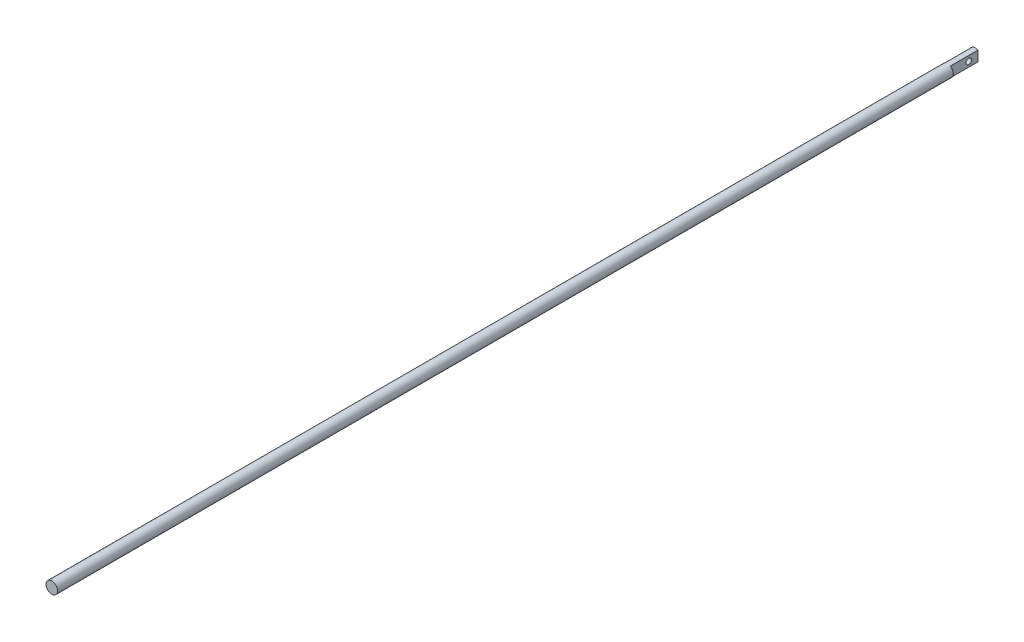
ISO-10303-21;
HEADER;
FILE_DESCRIPTION(('STEP AP214'),'2;1');
FILE_NAME('part.step','',(''),(''),'','','');
FILE_SCHEMA(('AUTOMOTIVE_DESIGN { 1 0 10303 214 1 1 1 1 }'));
ENDSEC;
DATA;
#1=APPLICATION_CONTEXT('core data for automotive mechanical design processes');
#2=APPLICATION_PROTOCOL_DEFINITION('international standard','automotive_design',2000,#1);
#3=PRODUCT_CONTEXT('',#1,'mechanical');
#4=PRODUCT('Part','Part','',(#3));
#5=PRODUCT_RELATED_PRODUCT_CATEGORY('part','',(#4));
#6=PRODUCT_DEFINITION_FORMATION('','',#4);
#7=PRODUCT_DEFINITION_CONTEXT('part definition',#1,'design');
#8=PRODUCT_DEFINITION('design','',#6,#7);
#9=PRODUCT_DEFINITION_SHAPE('','',#8);
#10=(LENGTH_UNIT() NAMED_UNIT(*) SI_UNIT(.MILLI.,.METRE.));
#11=(NAMED_UNIT(*) PLANE_ANGLE_UNIT() SI_UNIT($,.RADIAN.));
#12=(NAMED_UNIT(*) SI_UNIT($,.STERADIAN.) SOLID_ANGLE_UNIT());
#13=UNCERTAINTY_MEASURE_WITH_UNIT(LENGTH_MEASURE(1.E-05),#10,'distance_accuracy_value','');
#14=(GEOMETRIC_REPRESENTATION_CONTEXT(3) GLOBAL_UNCERTAINTY_ASSIGNED_CONTEXT((#13)) GLOBAL_UNIT_ASSIGNED_CONTEXT((#10,
#11,#12)) REPRESENTATION_CONTEXT('',''));
#15=CARTESIAN_POINT('',(0.,0.,0.));
#16=DIRECTION('',(0.,0.,1.));
#17=DIRECTION('',(1.,0.,0.));
#18=AXIS2_PLACEMENT_3D('',#15,#16,#17);
#19=CARTESIAN_POINT('',(0.762000000000001,-1.5875,0.));
#20=DIRECTION('',(-1.,0.,0.));
#21=DIRECTION('',(0.,0.,1.));
#22=AXIS2_PLACEMENT_3D('',#19,#20,#21);
#23=PLANE('',#22);
#24=DIRECTION('',(0.,1.,0.));
#25=VECTOR('',#24,1.);
#26=CARTESIAN_POINT('',(0.762000000000001,-1.5875,7.62));
#27=LINE('',#26,#25);
#28=CARTESIAN_POINT('',(0.762000000000001,-1.39266372466579,7.61999999999999));
#29=VERTEX_POINT('',#28);
#30=CARTESIAN_POINT('',(0.762000000000001,1.39266372466579,7.61999999999999));
#31=VERTEX_POINT('',#30);
#32=EDGE_CURVE('E82',#29,#31,#27,.T.);
#33=ORIENTED_EDGE('',*,*,#32,.F.);
#34=DIRECTION('',(0.,0.,-1.));
#35=VECTOR('',#34,1.);
#36=CARTESIAN_POINT('',(0.762000000000004,-1.39266372466579,254.));
#37=LINE('',#36,#35);
#38=CARTESIAN_POINT('',(0.762000000000001,-1.39266372466579,0.));
#39=VERTEX_POINT('',#38);
#40=EDGE_CURVE('E92',#39,#29,#37,.F.);
#41=ORIENTED_EDGE('',*,*,#40,.F.);
#42=DIRECTION('',(0.,-1.,0.));
#43=VECTOR('',#42,1.);
#44=CARTESIAN_POINT('',(0.762000000000001,0.,0.));
#45=LINE('',#44,#43);
#46=CARTESIAN_POINT('',(0.762000000000001,1.39266372466579,0.));
#47=VERTEX_POINT('',#46);
#48=EDGE_CURVE('E86',#47,#39,#45,.T.);
#49=ORIENTED_EDGE('',*,*,#48,.F.);
#50=DIRECTION('',(0.,0.,-1.));
#51=VECTOR('',#50,1.);
#52=CARTESIAN_POINT('',(0.762000000000004,1.39266372466579,254.));
#53=LINE('',#52,#51);
#54=EDGE_CURVE('E88',#31,#47,#53,.T.);
#55=ORIENTED_EDGE('',*,*,#54,.F.);
#56=EDGE_LOOP('',(#33,#41,#49,#55));
#57=FACE_BOUND('',#56,.T.);
#58=CARTESIAN_POINT('',(0.762000000000001,0.,2.54));
#59=DIRECTION('',(-1.,0.,0.));
#60=DIRECTION('',(0.,0.,1.));
#61=AXIS2_PLACEMENT_3D('',#58,#59,#60);
#62=CIRCLE('',#61,0.762);
#63=CARTESIAN_POINT('',(0.762000000000001,0.,3.302));
#64=VERTEX_POINT('',#63);
#65=EDGE_CURVE('E110',#64,#64,#62,.T.);
#66=ORIENTED_EDGE('',*,*,#65,.T.);
#67=EDGE_LOOP('',(#66));
#68=FACE_BOUND('',#67,.T.);
#69=ADVANCED_FACE('F33',(#57,#68),#23,.F.);
#70=CARTESIAN_POINT('',(-0.761999999999999,-1.5875,0.));
#71=DIRECTION('',(1.,0.,0.));
#72=DIRECTION('',(0.,0.,-1.));
#73=AXIS2_PLACEMENT_3D('',#70,#71,#72);
#74=PLANE('',#73);
#75=DIRECTION('',(0.,1.,0.));
#76=VECTOR('',#75,1.);
#77=CARTESIAN_POINT('',(-0.761999999999999,-1.5875,7.62));
#78=LINE('',#77,#76);
#79=CARTESIAN_POINT('',(-0.761999999999999,-1.39266372466579,7.61999999999999));
#80=VERTEX_POINT('',#79);
#81=CARTESIAN_POINT('',(-0.761999999999999,1.39266372466579,7.61999999999999));
#82=VERTEX_POINT('',#81);
#83=EDGE_CURVE('E108',#80,#82,#78,.T.);
#84=ORIENTED_EDGE('',*,*,#83,.T.);
#85=DIRECTION('',(0.,0.,-1.));
#86=VECTOR('',#85,1.);
#87=CARTESIAN_POINT('',(-0.761999999999996,1.3926637246658,254.));
#88=LINE('',#87,#86);
#89=CARTESIAN_POINT('',(-0.761999999999999,1.39266372466579,0.));
#90=VERTEX_POINT('',#89);
#91=EDGE_CURVE('E48',#90,#82,#88,.F.);
#92=ORIENTED_EDGE('',*,*,#91,.F.);
#93=DIRECTION('',(0.,1.,0.));
#94=VECTOR('',#93,1.);
#95=CARTESIAN_POINT('',(-0.761999999999999,0.,0.));
#96=LINE('',#95,#94);
#97=CARTESIAN_POINT('',(-0.761999999999999,-1.39266372466579,0.));
#98=VERTEX_POINT('',#97);
#99=EDGE_CURVE('E41',#98,#90,#96,.T.);
#100=ORIENTED_EDGE('',*,*,#99,.F.);
#101=DIRECTION('',(0.,0.,-1.));
#102=VECTOR('',#101,1.);
#103=CARTESIAN_POINT('',(-0.761999999999996,-1.3926637246658,254.));
#104=LINE('',#103,#102);
#105=EDGE_CURVE('E76',#80,#98,#104,.T.);
#106=ORIENTED_EDGE('',*,*,#105,.F.);
#107=EDGE_LOOP('',(#84,#92,#100,#106));
#108=FACE_BOUND('',#107,.T.);
#109=CARTESIAN_POINT('',(-0.761999999999999,0.,2.54));
#110=DIRECTION('',(1.,0.,0.));
#111=DIRECTION('',(0.,0.,-1.));
#112=AXIS2_PLACEMENT_3D('',#109,#110,#111);
#113=CIRCLE('',#112,0.762);
#114=CARTESIAN_POINT('',(-0.761999999999999,0.,1.778));
#115=VERTEX_POINT('',#114);
#116=EDGE_CURVE('E113',#115,#115,#113,.F.);
#117=ORIENTED_EDGE('',*,*,#116,.F.);
#118=EDGE_LOOP('',(#117));
#119=FACE_BOUND('',#118,.T.);
#120=ADVANCED_FACE('F74',(#108,#119),#74,.F.);
#121=CARTESIAN_POINT('',(0.,0.,254.));
#122=DIRECTION('',(0.,0.,-1.));
#123=DIRECTION('',(-1.,0.,0.));
#124=AXIS2_PLACEMENT_3D('',#121,#122,#123);
#125=CYLINDRICAL_SURFACE('',#124,1.5875);
#126=CARTESIAN_POINT('',(0.,0.,254.));
#127=DIRECTION('',(0.,0.,1.));
#128=DIRECTION('',(1.,0.,0.));
#129=AXIS2_PLACEMENT_3D('',#126,#127,#128);
#130=CIRCLE('',#129,1.5875);
#131=CARTESIAN_POINT('',(1.5875,0.,254.));
#132=VERTEX_POINT('',#131);
#133=EDGE_CURVE('E90',#132,#132,#130,.T.);
#134=ORIENTED_EDGE('',*,*,#133,.F.);
#135=EDGE_LOOP('',(#134));
#136=FACE_BOUND('',#135,.T.);
#137=CARTESIAN_POINT('',(0.,0.,0.));
#138=DIRECTION('',(0.,0.,1.));
#139=DIRECTION('',(1.,0.,0.));
#140=AXIS2_PLACEMENT_3D('',#137,#138,#139);
#141=CIRCLE('',#140,1.5875);
#142=EDGE_CURVE('E87',#47,#90,#141,.T.);
#143=ORIENTED_EDGE('',*,*,#142,.T.);
#144=ORIENTED_EDGE('',*,*,#91,.T.);
#145=CARTESIAN_POINT('',(0.,0.,7.61999999999999));
#146=DIRECTION('',(0.,0.,1.));
#147=DIRECTION('',(1.,0.,0.));
#148=AXIS2_PLACEMENT_3D('',#145,#146,#147);
#149=CIRCLE('',#148,1.5875);
#150=EDGE_CURVE('E11',#82,#80,#149,.T.);
#151=ORIENTED_EDGE('',*,*,#150,.T.);
#152=ORIENTED_EDGE('',*,*,#105,.T.);
#153=EDGE_CURVE('E56',#98,#39,#141,.T.);
#154=ORIENTED_EDGE('',*,*,#153,.T.);
#155=ORIENTED_EDGE('',*,*,#40,.T.);
#156=CARTESIAN_POINT('',(0.,0.,7.61999999999999));
#157=DIRECTION('',(0.,0.,1.));
#158=DIRECTION('',(1.,0.,0.));
#159=AXIS2_PLACEMENT_3D('',#156,#157,#158);
#160=CIRCLE('',#159,1.5875);
#161=EDGE_CURVE('E81',#29,#31,#160,.T.);
#162=ORIENTED_EDGE('',*,*,#161,.T.);
#163=ORIENTED_EDGE('',*,*,#54,.T.);
#164=EDGE_LOOP('',(#143,#144,#151,#152,#154,#155,#162,#163));
#165=FACE_BOUND('',#164,.T.);
#166=ADVANCED_FACE('F35',(#136,#165),#125,.T.);
#167=CARTESIAN_POINT('',(0.,0.,254.));
#168=DIRECTION('',(0.,0.,1.));
#169=DIRECTION('',(1.,0.,0.));
#170=AXIS2_PLACEMENT_3D('',#167,#168,#169);
#171=PLANE('',#170);
#172=ORIENTED_EDGE('',*,*,#133,.T.);
#173=EDGE_LOOP('',(#172));
#174=FACE_BOUND('',#173,.T.);
#175=ADVANCED_FACE('F124',(#174),#171,.T.);
#176=CARTESIAN_POINT('',(0.,0.,0.));
#177=DIRECTION('',(0.,0.,1.));
#178=DIRECTION('',(1.,0.,0.));
#179=AXIS2_PLACEMENT_3D('',#176,#177,#178);
#180=PLANE('',#179);
#181=ORIENTED_EDGE('',*,*,#153,.F.);
#182=ORIENTED_EDGE('',*,*,#99,.T.);
#183=ORIENTED_EDGE('',*,*,#142,.F.);
#184=ORIENTED_EDGE('',*,*,#48,.T.);
#185=EDGE_LOOP('',(#181,#182,#183,#184));
#186=FACE_BOUND('',#185,.T.);
#187=ADVANCED_FACE('F85',(#186),#180,.F.);
#188=CARTESIAN_POINT('',(0.762000000000001,-1.5875,7.62));
#189=DIRECTION('',(0.,0.,1.));
#190=DIRECTION('',(1.,0.,0.));
#191=AXIS2_PLACEMENT_3D('',#188,#189,#190);
#192=PLANE('',#191);
#193=ORIENTED_EDGE('',*,*,#161,.F.);
#194=ORIENTED_EDGE('',*,*,#32,.T.);
#195=EDGE_LOOP('',(#193,#194));
#196=FACE_BOUND('',#195,.T.);
#197=ADVANCED_FACE('F103',(#196),#192,.F.);
#198=CARTESIAN_POINT('',(-0.761999999999999,-1.5875,7.62));
#199=DIRECTION('',(0.,0.,1.));
#200=DIRECTION('',(1.,0.,0.));
#201=AXIS2_PLACEMENT_3D('',#198,#199,#200);
#202=PLANE('',#201);
#203=ORIENTED_EDGE('',*,*,#83,.F.);
#204=ORIENTED_EDGE('',*,*,#150,.F.);
#205=EDGE_LOOP('',(#203,#204));
#206=FACE_BOUND('',#205,.T.);
#207=ADVANCED_FACE('F129',(#206),#202,.F.);
#208=CARTESIAN_POINT('',(1.5885,0.,2.54));
#209=DIRECTION('',(-1.,0.,0.));
#210=DIRECTION('',(0.,0.,1.));
#211=AXIS2_PLACEMENT_3D('',#208,#209,#210);
#212=CYLINDRICAL_SURFACE('',#211,0.762);
#213=ORIENTED_EDGE('',*,*,#65,.F.);
#214=EDGE_LOOP('',(#213));
#215=FACE_BOUND('',#214,.T.);
#216=ORIENTED_EDGE('',*,*,#116,.T.);
#217=EDGE_LOOP('',(#216));
#218=FACE_BOUND('',#217,.T.);
#219=ADVANCED_FACE('F117',(#215,#218),#212,.F.);
#220=CLOSED_SHELL('',(#69,#120,#166,#175,#187,#197,#207,#219));
#221=MANIFOLD_SOLID_BREP('B2',#220);
#222=ADVANCED_BREP_SHAPE_REPRESENTATION('',(#18,#221),#14);
#223=SHAPE_DEFINITION_REPRESENTATION(#9,#222);
ENDSEC;
END-ISO-10303-21;
